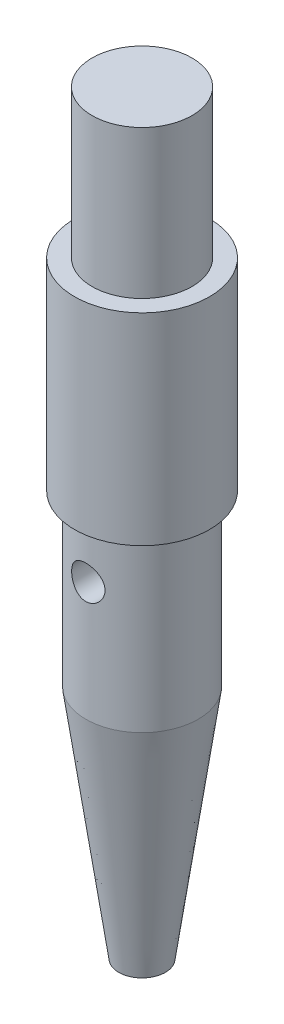
ISO-10303-21;
HEADER;
FILE_DESCRIPTION(('STEP AP214'),'2;1');
FILE_NAME('part.step','',(''),(''),'','','');
FILE_SCHEMA(('AUTOMOTIVE_DESIGN { 1 0 10303 214 1 1 1 1 }'));
ENDSEC;
DATA;
#1=APPLICATION_CONTEXT('core data for automotive mechanical design processes');
#2=APPLICATION_PROTOCOL_DEFINITION('international standard','automotive_design',2000,#1);
#3=PRODUCT_CONTEXT('',#1,'mechanical');
#4=PRODUCT('Part','Part','',(#3));
#5=PRODUCT_RELATED_PRODUCT_CATEGORY('part','',(#4));
#6=PRODUCT_DEFINITION_FORMATION('','',#4);
#7=PRODUCT_DEFINITION_CONTEXT('part definition',#1,'design');
#8=PRODUCT_DEFINITION('design','',#6,#7);
#9=PRODUCT_DEFINITION_SHAPE('','',#8);
#10=(LENGTH_UNIT() NAMED_UNIT(*) SI_UNIT(.MILLI.,.METRE.));
#11=(NAMED_UNIT(*) PLANE_ANGLE_UNIT() SI_UNIT($,.RADIAN.));
#12=(NAMED_UNIT(*) SI_UNIT($,.STERADIAN.) SOLID_ANGLE_UNIT());
#13=UNCERTAINTY_MEASURE_WITH_UNIT(LENGTH_MEASURE(1.E-05),#10,'distance_accuracy_value','');
#14=(GEOMETRIC_REPRESENTATION_CONTEXT(3) GLOBAL_UNCERTAINTY_ASSIGNED_CONTEXT((#13)) GLOBAL_UNIT_ASSIGNED_CONTEXT((#10,
#11,#12)) REPRESENTATION_CONTEXT('',''));
#15=CARTESIAN_POINT('',(0.,0.,0.));
#16=DIRECTION('',(0.,0.,1.));
#17=DIRECTION('',(1.,0.,0.));
#18=AXIS2_PLACEMENT_3D('',#15,#16,#17);
#19=CARTESIAN_POINT('',(0.,0.,0.));
#20=DIRECTION('',(0.,1.,0.));
#21=DIRECTION('',(0.,0.,1.));
#22=AXIS2_PLACEMENT_3D('',#19,#20,#21);
#23=PLANE('',#22);
#24=CARTESIAN_POINT('',(0.,0.,0.));
#25=DIRECTION('',(0.,-1.,0.));
#26=DIRECTION('',(0.,0.,-1.));
#27=AXIS2_PLACEMENT_3D('',#24,#25,#26);
#28=CIRCLE('',#27,4.953);
#29=CARTESIAN_POINT('',(0.,0.,-4.953));
#30=VERTEX_POINT('',#29);
#31=EDGE_CURVE('E10',#30,#30,#28,.T.);
#32=ORIENTED_EDGE('',*,*,#31,.F.);
#33=EDGE_LOOP('',(#32));
#34=FACE_BOUND('',#33,.T.);
#35=ADVANCED_FACE('F33',(#34),#23,.T.);
#36=CARTESIAN_POINT('',(0.,-74.8792,0.));
#37=DIRECTION('',(0.,-1.,0.));
#38=DIRECTION('',(0.,0.,-1.));
#39=AXIS2_PLACEMENT_3D('',#36,#37,#38);
#40=CYLINDRICAL_SURFACE('',#39,4.953);
#41=ORIENTED_EDGE('',*,*,#31,.T.);
#42=EDGE_LOOP('',(#41));
#43=FACE_BOUND('',#42,.T.);
#44=CARTESIAN_POINT('',(0.,-14.6812,0.));
#45=DIRECTION('',(0.,-1.,0.));
#46=DIRECTION('',(0.,0.,-1.));
#47=AXIS2_PLACEMENT_3D('',#44,#45,#46);
#48=CIRCLE('',#47,4.953);
#49=CARTESIAN_POINT('',(0.,-14.6812,-4.953));
#50=VERTEX_POINT('',#49);
#51=EDGE_CURVE('E44',#50,#50,#48,.T.);
#52=ORIENTED_EDGE('',*,*,#51,.F.);
#53=EDGE_LOOP('',(#52));
#54=FACE_BOUND('',#53,.T.);
#55=ADVANCED_FACE('F81',(#43,#54),#40,.T.);
#56=CARTESIAN_POINT('',(4.953,-14.6812,0.));
#57=DIRECTION('',(0.,1.,0.));
#58=DIRECTION('',(0.,0.,1.));
#59=AXIS2_PLACEMENT_3D('',#56,#57,#58);
#60=PLANE('',#59);
#61=ORIENTED_EDGE('',*,*,#51,.T.);
#62=EDGE_LOOP('',(#61));
#63=FACE_BOUND('',#62,.T.);
#64=CARTESIAN_POINT('',(0.,-14.6812,0.));
#65=DIRECTION('',(0.,-1.,0.));
#66=DIRECTION('',(0.,0.,-1.));
#67=AXIS2_PLACEMENT_3D('',#64,#65,#66);
#68=CIRCLE('',#67,6.6929);
#69=CARTESIAN_POINT('',(0.,-14.6812,-6.6929));
#70=VERTEX_POINT('',#69);
#71=EDGE_CURVE('E49',#70,#70,#68,.T.);
#72=ORIENTED_EDGE('',*,*,#71,.F.);
#73=EDGE_LOOP('',(#72));
#74=FACE_BOUND('',#73,.T.);
#75=ADVANCED_FACE('F86',(#63,#74),#60,.T.);
#76=CARTESIAN_POINT('',(0.,-74.8792,0.));
#77=DIRECTION('',(0.,-1.,0.));
#78=DIRECTION('',(0.,0.,-1.));
#79=AXIS2_PLACEMENT_3D('',#76,#77,#78);
#80=CYLINDRICAL_SURFACE('',#79,6.6929);
#81=ORIENTED_EDGE('',*,*,#71,.T.);
#82=EDGE_LOOP('',(#81));
#83=FACE_BOUND('',#82,.T.);
#84=CARTESIAN_POINT('',(0.,-34.671,0.));
#85=DIRECTION('',(0.,-1.,0.));
#86=DIRECTION('',(0.,0.,-1.));
#87=AXIS2_PLACEMENT_3D('',#84,#85,#86);
#88=CIRCLE('',#87,6.6929);
#89=CARTESIAN_POINT('',(0.,-34.671,-6.6929));
#90=VERTEX_POINT('',#89);
#91=EDGE_CURVE('E104',#90,#90,#88,.T.);
#92=ORIENTED_EDGE('',*,*,#91,.F.);
#93=EDGE_LOOP('',(#92));
#94=FACE_BOUND('',#93,.T.);
#95=ADVANCED_FACE('F90',(#83,#94),#80,.T.);
#96=CARTESIAN_POINT('',(6.6929,-34.671,0.));
#97=DIRECTION('',(0.,-1.,0.));
#98=DIRECTION('',(0.,0.,-1.));
#99=AXIS2_PLACEMENT_3D('',#96,#97,#98);
#100=PLANE('',#99);
#101=ORIENTED_EDGE('',*,*,#91,.T.);
#102=EDGE_LOOP('',(#101));
#103=FACE_BOUND('',#102,.T.);
#104=CARTESIAN_POINT('',(0.,-34.671,0.));
#105=DIRECTION('',(0.,-1.,0.));
#106=DIRECTION('',(0.,0.,-1.));
#107=AXIS2_PLACEMENT_3D('',#104,#105,#106);
#108=CIRCLE('',#107,5.5753);
#109=CARTESIAN_POINT('',(0.,-34.671,-5.5753));
#110=VERTEX_POINT('',#109);
#111=EDGE_CURVE('E107',#110,#110,#108,.T.);
#112=ORIENTED_EDGE('',*,*,#111,.F.);
#113=EDGE_LOOP('',(#112));
#114=FACE_BOUND('',#113,.T.);
#115=ADVANCED_FACE('F76',(#103,#114),#100,.T.);
#116=CARTESIAN_POINT('',(0.,-74.8792,0.));
#117=DIRECTION('',(0.,-1.,0.));
#118=DIRECTION('',(0.,0.,-1.));
#119=AXIS2_PLACEMENT_3D('',#116,#117,#118);
#120=CYLINDRICAL_SURFACE('',#119,5.5753);
#121=CARTESIAN_POINT('',(0.,-38.0970595656282,-5.5753));
#122=CARTESIAN_POINT('',(0.0907802411633982,-38.0970607905842,-5.57529914266147));
#123=CARTESIAN_POINT('',(0.181572893017565,-38.1045583947508,-5.57306153356919));
#124=CARTESIAN_POINT('',(0.360517194851362,-38.1342814526153,-5.56435372778573));
#125=CARTESIAN_POINT('',(0.448667997720266,-38.1565115785953,-5.55788218835131));
#126=CARTESIAN_POINT('',(0.619721554631119,-38.2148942894362,-5.54141617336773));
#127=CARTESIAN_POINT('',(0.702631747012946,-38.2510266007506,-5.53142682961907));
#128=CARTESIAN_POINT('',(0.861216768298183,-38.3361057068908,-5.50896529131383));
#129=CARTESIAN_POINT('',(0.936890680979806,-38.3850541215027,-5.49649278296582));
#130=CARTESIAN_POINT('',(1.08098428363115,-38.4958274861462,-5.47000459030922));
#131=CARTESIAN_POINT('',(1.14917158895609,-38.5579472700839,-5.45595781307681));
#132=CARTESIAN_POINT('',(1.27432963206078,-38.6926714485337,-5.42809116674428));
#133=CARTESIAN_POINT('',(1.33129853275416,-38.7652775568804,-5.41427133514705));
#134=CARTESIAN_POINT('',(1.43361592469408,-38.920867873018,-5.38809553930276));
#135=CARTESIAN_POINT('',(1.47868249867588,-39.0040445933536,-5.37577827763025));
#136=CARTESIAN_POINT('',(1.55409424495715,-39.1772203584342,-5.35446615539304));
#137=CARTESIAN_POINT('',(1.58444286393929,-39.2672178001741,-5.34547051708121));
#138=CARTESIAN_POINT('',(1.62872248373754,-39.4488743866799,-5.33214386656876));
#139=CARTESIAN_POINT('',(1.64308118572963,-39.5404201467746,-5.32769161538743));
#140=CARTESIAN_POINT('',(1.65630872894102,-39.7247211722175,-5.32359499933366));
#141=CARTESIAN_POINT('',(1.65518122976173,-39.8174761466358,-5.32394949856003));
#142=CARTESIAN_POINT('',(1.63780469332006,-39.9980997125389,-5.32931876508754));
#143=CARTESIAN_POINT('',(1.62208950183643,-40.0860253591196,-5.33416899912475));
#144=CARTESIAN_POINT('',(1.57684540672711,-40.2579314646033,-5.34771734309298));
#145=CARTESIAN_POINT('',(1.54731516711079,-40.3419115410835,-5.3564158251662));
#146=CARTESIAN_POINT('',(1.47488170830861,-40.5048573455894,-5.37681325319708));
#147=CARTESIAN_POINT('',(1.43180389596621,-40.583740398709,-5.38855099692088));
#148=CARTESIAN_POINT('',(1.3336194993968,-40.7333379158727,-5.41368552163697));
#149=CARTESIAN_POINT('',(1.27851005584602,-40.8040504320649,-5.42708269666602));
#150=CARTESIAN_POINT('',(1.15516717170065,-40.9383299174178,-5.45469570565964));
#151=CARTESIAN_POINT('',(1.08649013304146,-41.0014878224341,-5.4689226433667));
#152=CARTESIAN_POINT('',(0.939342376550519,-41.1154841630565,-5.49610736127987));
#153=CARTESIAN_POINT('',(0.860871069665508,-41.1663218571511,-5.50906506506716));
#154=CARTESIAN_POINT('',(0.695630477391748,-41.2544756854373,-5.53236525250384));
#155=CARTESIAN_POINT('',(0.608811114718597,-41.291702840878,-5.54269039765384));
#156=CARTESIAN_POINT('',(0.429766695528277,-41.3509072872668,-5.55943716876977));
#157=CARTESIAN_POINT('',(0.337543119494253,-41.3728887337889,-5.56585985838185));
#158=CARTESIAN_POINT('',(0.153787111204834,-41.4003008647051,-5.5739105908195));
#159=CARTESIAN_POINT('',(0.0623443200199184,-41.4062861251294,-5.57569922295684));
#160=CARTESIAN_POINT('',(-0.120244174775801,-41.4030879766636,-5.5747504526234));
#161=CARTESIAN_POINT('',(-0.211389915532535,-41.3939065434801,-5.57201363966488));
#162=CARTESIAN_POINT('',(-0.388715830049852,-41.3610848180643,-5.5624264884329));
#163=CARTESIAN_POINT('',(-0.474961129571624,-41.3377670307201,-5.55566796269829));
#164=CARTESIAN_POINT('',(-0.64229780789176,-41.2777210950213,-5.53881773197232));
#165=CARTESIAN_POINT('',(-0.723388570942706,-41.2409913480306,-5.52872562964958));
#166=CARTESIAN_POINT('',(-0.880166943044439,-41.1542230706671,-5.505969360247));
#167=CARTESIAN_POINT('',(-0.955689277755801,-41.1039002854097,-5.4932518130308));
#168=CARTESIAN_POINT('',(-1.09740700477669,-40.9917210243316,-5.46670603450193));
#169=CARTESIAN_POINT('',(-1.16360010315656,-40.9298617204977,-5.45287753132838));
#170=CARTESIAN_POINT('',(-1.28721163416514,-40.7937610575127,-5.4250546027142));
#171=CARTESIAN_POINT('',(-1.34423576131156,-40.7191584584817,-5.4110716771849));
#172=CARTESIAN_POINT('',(-1.44498131853299,-40.5611395827373,-5.38504560835295));
#173=CARTESIAN_POINT('',(-1.48870312801809,-40.4777235574929,-5.37300240972982));
#174=CARTESIAN_POINT('',(-1.56129832361535,-40.3047323095579,-5.35235872398914));
#175=CARTESIAN_POINT('',(-1.59024344957815,-40.2151892853994,-5.34374164928681));
#176=CARTESIAN_POINT('',(-1.63256181057368,-40.0321979301816,-5.33096708719469));
#177=CARTESIAN_POINT('',(-1.64594023215815,-39.9387509106206,-5.32680811448023));
#178=CARTESIAN_POINT('',(-1.65639821065536,-39.7546938796581,-5.32356471626976));
#179=CARTESIAN_POINT('',(-1.65411952408281,-39.6641233699158,-5.32428047351298));
#180=CARTESIAN_POINT('',(-1.63485530584216,-39.4847188608179,-5.33022678726905));
#181=CARTESIAN_POINT('',(-1.61787033894699,-39.3958847949108,-5.33545717040435));
#182=CARTESIAN_POINT('',(-1.57008581616959,-39.223498386111,-5.34971087708398));
#183=CARTESIAN_POINT('',(-1.53945261039898,-39.1398958705626,-5.35868844759406));
#184=CARTESIAN_POINT('',(-1.46537041679873,-38.9789503352442,-5.37941748123782));
#185=CARTESIAN_POINT('',(-1.42191901852471,-38.9016084962756,-5.39116946601338));
#186=CARTESIAN_POINT('',(-1.32161626035209,-38.7523925998984,-5.41664702457347));
#187=CARTESIAN_POINT('',(-1.2643417911703,-38.6808124300628,-5.43042808970933));
#188=CARTESIAN_POINT('',(-1.138784773298,-38.5480710840895,-5.45813761343477));
#189=CARTESIAN_POINT('',(-1.070499390332,-38.4869125989153,-5.47206610910904));
#190=CARTESIAN_POINT('',(-0.922525406850511,-38.3750240281485,-5.49897470155598));
#191=CARTESIAN_POINT('',(-0.842568287914601,-38.3246389630408,-5.51191668894157));
#192=CARTESIAN_POINT('',(-0.674933794362826,-38.2380986668353,-5.53494113638268));
#193=CARTESIAN_POINT('',(-0.587260203079221,-38.2019365093852,-5.54502498763951));
#194=CARTESIAN_POINT('',(-0.416921038533645,-38.1482688752457,-5.560271209017));
#195=CARTESIAN_POINT('',(-0.334809554089188,-38.1291166008229,-5.56586103337043));
#196=CARTESIAN_POINT('',(-0.168468716501111,-38.1035123855199,-5.57337553579345));
#197=CARTESIAN_POINT('',(-0.0842397016413105,-38.0970584289278,-5.57530079556896));
#198=CARTESIAN_POINT('',(0.,-38.0970595656282,-5.5753));
#199=B_SPLINE_CURVE_WITH_KNOTS('',3,(#121,#122,#123,#124,#125,#126,#127,#128,#129,#130,#131,
#132,#133,#134,#135,#136,#137,#138,#139,#140,#141,#142,#143,#144,#145,#146,#147,#148,#149,#150,
#151,#152,#153,#154,#155,#156,#157,#158,#159,#160,#161,#162,#163,#164,#165,#166,#167,#168,#169,
#170,#171,#172,#173,#174,#175,#176,#177,#178,#179,#180,#181,#182,#183,#184,#185,#186,#187,#188,
#189,#190,#191,#192,#193,#194,#195,#196,#197,#198),.UNSPECIFIED.,.T.,.F.,(4,2,2,2,2,2,2,2,2,2,2,
2,2,2,2,2,2,2,2,2,2,2,2,2,2,2,2,2,2,2,2,2,2,2,2,2,2,2,4),(0.,0.272031345676703,
0.544149004872505,0.815871330002298,1.08762801383496,1.36627030726463,1.64495819229808,
1.92975146322386,2.21447800839892,2.49139063740292,2.76823782928676,3.03533689256634,
3.30246179112579,3.57318097801205,3.84396457163049,4.12579225574432,4.40763689789715,
4.69129247373157,4.97487070219985,5.2484816224749,5.52205690332012,5.78961415058622,
6.05720329970634,6.33089137035246,6.60464662012459,6.88810768358827,7.17156066138783,
7.4536240839478,7.73559350100814,8.0060764931205,8.27654909819465,8.54381161555676,
8.81112442335897,9.08798312871783,9.36491321327154,9.6496986677713,9.9343452636047,
10.186817361062,10.4392493782412),.UNSPECIFIED.);
#200=CARTESIAN_POINT('',(0.,-38.0970595656282,-5.5753));
#201=VERTEX_POINT('',#200);
#202=EDGE_CURVE('E36',#201,#201,#199,.T.);
#203=ORIENTED_EDGE('',*,*,#202,.F.);
#204=EDGE_LOOP('',(#203));
#205=FACE_BOUND('',#204,.T.);
#206=CARTESIAN_POINT('',(1.65394043437183,-39.751,5.32432635453068));
#207=CARTESIAN_POINT('',(1.65393917914126,-39.6603189690323,5.32432737917467));
#208=CARTESIAN_POINT('',(1.64645737539418,-39.569625484091,5.32666834911707));
#209=CARTESIAN_POINT('',(1.61680276074434,-39.3908866308507,5.3357428996998));
#210=CARTESIAN_POINT('',(1.59462479040269,-39.3028422039191,5.34247802299938));
#211=CARTESIAN_POINT('',(1.53639442535403,-39.1320146341413,5.35951240208173));
#212=CARTESIAN_POINT('',(1.50036472525983,-39.0492231420601,5.36980582519466));
#213=CARTESIAN_POINT('',(1.41552789592493,-38.8908402188101,5.39278914911507));
#214=CARTESIAN_POINT('',(1.36671894649194,-38.8152498154106,5.4054793912379));
#215=CARTESIAN_POINT('',(1.25609221981284,-38.6710756822129,5.43226686768645));
#216=CARTESIAN_POINT('',(1.19394816525942,-38.6027477264116,5.44639356871852));
#217=CARTESIAN_POINT('',(1.05911475440682,-38.4773143466053,5.4742102533635));
#218=CARTESIAN_POINT('',(0.9864240740517,-38.4202103338113,5.487900181879));
#219=CARTESIAN_POINT('',(0.830746129435811,-38.3177398065788,5.51363493333166));
#220=CARTESIAN_POINT('',(0.747580688068579,-38.272633398101,5.52564098483369));
#221=CARTESIAN_POINT('',(0.574428475664158,-38.1971450376114,5.54631332045601));
#222=CARTESIAN_POINT('',(0.484443146140982,-38.1667599839413,5.55498030800844));
#223=CARTESIAN_POINT('',(0.302880779966216,-38.1224213268895,5.56778949977213));
#224=CARTESIAN_POINT('',(0.211418936768315,-38.1080312934187,5.57205164999219));
#225=CARTESIAN_POINT('',(0.0272864798679038,-38.09471188611,5.5759930255076));
#226=CARTESIAN_POINT('',(-0.0653838814782747,-38.0957793345792,5.57567319275048));
#227=CARTESIAN_POINT('',(-0.24624357124569,-38.1130501262266,5.57057175124873));
#228=CARTESIAN_POINT('',(-0.334482565589962,-38.1287809726815,5.56592943063237));
#229=CARTESIAN_POINT('',(-0.507006683960489,-38.1741610902161,5.55287339181028));
#230=CARTESIAN_POINT('',(-0.591291559406712,-38.2038112350614,5.54445943684664));
#231=CARTESIAN_POINT('',(-0.754646740421004,-38.276512571547,5.52461150368794));
#232=CARTESIAN_POINT('',(-0.833646050739759,-38.3197137423853,5.51314395499649));
#233=CARTESIAN_POINT('',(-0.983426145382607,-38.4181725700512,5.4884072537664));
#234=CARTESIAN_POINT('',(-1.05420500872418,-38.4734330362859,5.47513768168994));
#235=CARTESIAN_POINT('',(-1.18835514905681,-38.5968985929272,5.44762804607657));
#236=CARTESIAN_POINT('',(-1.25134620387792,-38.6655134016187,5.43337025577784));
#237=CARTESIAN_POINT('',(-1.36503362194885,-38.8124726535408,5.40593031988283));
#238=CARTESIAN_POINT('',(-1.41572881906094,-38.8908180185516,5.39274827638886));
#239=CARTESIAN_POINT('',(-1.50377031408258,-39.0559966786964,5.36886895890241));
#240=CARTESIAN_POINT('',(-1.54098960530888,-39.1429013852378,5.35819564256094));
#241=CARTESIAN_POINT('',(-1.60015378134707,-39.3221347434496,5.34082761231837));
#242=CARTESIAN_POINT('',(-1.62210351931059,-39.4144616616416,5.33413163439109));
#243=CARTESIAN_POINT('',(-1.64940069128246,-39.5983063939368,5.32575301487996));
#244=CARTESIAN_POINT('',(-1.65532497344741,-39.6897306956492,5.32389627508161));
#245=CARTESIAN_POINT('',(-1.65201170154269,-39.8722689769403,5.32492546622159));
#246=CARTESIAN_POINT('',(-1.6427762138404,-39.9633829971159,5.32781075079369));
#247=CARTESIAN_POINT('',(-1.60991878367741,-40.1403280359838,5.33782829384685));
#248=CARTESIAN_POINT('',(-1.58666571148472,-40.2262343468849,5.34485155828845));
#249=CARTESIAN_POINT('',(-1.52685951608476,-40.3929211928842,5.36224146574483));
#250=CARTESIAN_POINT('',(-1.490304370606,-40.4737009464143,5.37260861709275));
#251=CARTESIAN_POINT('',(-1.40382956891896,-40.6301948137953,5.39585785019216));
#252=CARTESIAN_POINT('',(-1.35358316418164,-40.7057193814354,5.40879899786436));
#253=CARTESIAN_POINT('',(-1.24154193838871,-40.8474757690747,5.43560997910918));
#254=CARTESIAN_POINT('',(-1.1797444152248,-40.9137054083876,5.44948002948824));
#255=CARTESIAN_POINT('',(-1.04364769288122,-41.0375014457323,5.47720352512237));
#256=CARTESIAN_POINT('',(-0.968972230247275,-41.0946595320869,5.49103759021682));
#257=CARTESIAN_POINT('',(-0.810761496313387,-41.1956416899098,5.51661557586261));
#258=CARTESIAN_POINT('',(-0.727226672140727,-41.2394664338734,5.52835960181708));
#259=CARTESIAN_POINT('',(-0.554228182383954,-41.3121154813929,5.54836168135512));
#260=CARTESIAN_POINT('',(-0.464814974899403,-41.341052398502,5.55664581337579));
#261=CARTESIAN_POINT('',(-0.282105760887226,-41.3833977965194,5.56890989329988));
#262=CARTESIAN_POINT('',(-0.188810845919881,-41.3968106127341,5.57289104284636));
#263=CARTESIAN_POINT('',(-0.00476398584839497,-41.4074033352318,5.57602914014529));
#264=CARTESIAN_POINT('',(0.0859512676096006,-41.4051760315405,5.57536226413883));
#265=CARTESIAN_POINT('',(0.265659384424444,-41.3859645539737,5.56969270699693));
#266=CARTESIAN_POINT('',(0.354652341470175,-41.3689811851132,5.56469026238783));
#267=CARTESIAN_POINT('',(0.527499805585039,-41.3211035421235,5.55096035213885));
#268=CARTESIAN_POINT('',(0.611397785782953,-41.2903543018529,5.54227177144117));
#269=CARTESIAN_POINT('',(0.772888271105474,-41.2159472734931,5.52206880884273));
#270=CARTESIAN_POINT('',(0.850479750720966,-41.1722873913185,5.51055396857873));
#271=CARTESIAN_POINT('',(0.999808255239099,-41.0717042071741,5.48545987666298));
#272=CARTESIAN_POINT('',(1.07128416123679,-41.0144067095163,5.47182705738531));
#273=CARTESIAN_POINT('',(1.20380503545887,-40.8888523332727,5.44420928885713));
#274=CARTESIAN_POINT('',(1.26484701886193,-40.8205923294497,5.43022424015309));
#275=CARTESIAN_POINT('',(1.37653982144767,-40.6726781947508,5.40300976571577));
#276=CARTESIAN_POINT('',(1.42683864541681,-40.5927514065934,5.38981393747242));
#277=CARTESIAN_POINT('',(1.5132250315855,-40.4251976115719,5.36620325979076));
#278=CARTESIAN_POINT('',(1.54931969590265,-40.3375744797773,5.35578702139094));
#279=CARTESIAN_POINT('',(1.60286238745984,-40.1673905417915,5.33998970785653));
#280=CARTESIAN_POINT('',(1.62196474607064,-40.0853880956361,5.33417058071028));
#281=CARTESIAN_POINT('',(1.64750315096634,-39.9192604029224,5.32633878958889));
#282=CARTESIAN_POINT('',(1.65394159899831,-39.8351355619482,5.32432540384675));
#283=CARTESIAN_POINT('',(1.65394043437183,-39.751,5.32432635453068));
#284=B_SPLINE_CURVE_WITH_KNOTS('',3,(#206,#207,#208,#209,#210,#211,#212,#213,#214,#215,#216,
#217,#218,#219,#220,#221,#222,#223,#224,#225,#226,#227,#228,#229,#230,#231,#232,#233,#234,#235,
#236,#237,#238,#239,#240,#241,#242,#243,#244,#245,#246,#247,#248,#249,#250,#251,#252,#253,#254,
#255,#256,#257,#258,#259,#260,#261,#262,#263,#264,#265,#266,#267,#268,#269,#270,#271,#272,#273,
#274,#275,#276,#277,#278,#279,#280,#281,#282,#283),.UNSPECIFIED.,.T.,.F.,(4,2,2,2,2,2,2,2,2,2,2,
2,2,2,2,2,2,2,2,2,2,2,2,2,2,2,2,2,2,2,2,2,2,2,2,2,2,2,4),(0.,0.271732836910582,0.54356112267639,
0.814945931190811,1.08636941502197,1.36540058529223,1.64446681635625,1.92916437819885,
2.21380193068985,2.49046632024446,2.76707383494804,3.03506542888368,3.30307384789081,
3.57415990501412,3.84530918354667,4.12668842412222,4.40809434024717,4.69208733797616,
4.97599003237204,5.24952826078383,5.52302920739345,5.78962933587541,6.05627001166356,
6.32993608020658,6.60366624669005,6.88746591349909,7.1712512638994,7.45285724066669,
7.73438455632641,8.00530064434734,8.27620195350891,8.54431393339603,8.81246942449294,
9.08906465907937,9.36573888703055,9.65042306376421,9.93496471624353,10.1871313695013,
10.4392501940146),.UNSPECIFIED.);
#285=CARTESIAN_POINT('',(1.65394043437183,-39.751,5.32432635453068));
#286=VERTEX_POINT('',#285);
#287=EDGE_CURVE('E52',#286,#286,#284,.T.);
#288=ORIENTED_EDGE('',*,*,#287,.F.);
#289=EDGE_LOOP('',(#288));
#290=FACE_BOUND('',#289,.T.);
#291=ORIENTED_EDGE('',*,*,#111,.T.);
#292=EDGE_LOOP('',(#291));
#293=FACE_BOUND('',#292,.T.);
#294=CARTESIAN_POINT('',(0.,-51.5112,0.));
#295=DIRECTION('',(0.,-1.,0.));
#296=DIRECTION('',(0.,0.,-1.));
#297=AXIS2_PLACEMENT_3D('',#294,#295,#296);
#298=CIRCLE('',#297,5.5753);
#299=CARTESIAN_POINT('',(0.,-51.5112,-5.5753));
#300=VERTEX_POINT('',#299);
#301=EDGE_CURVE('E109',#300,#300,#298,.T.);
#302=ORIENTED_EDGE('',*,*,#301,.F.);
#303=EDGE_LOOP('',(#302));
#304=FACE_BOUND('',#303,.T.);
#305=ADVANCED_FACE('F56',(#205,#290,#293,#304),#120,.T.);
#306=CARTESIAN_POINT('',(0.,-74.8792,0.));
#307=DIRECTION('',(0.,1.,0.));
#308=DIRECTION('',(0.,0.,1.));
#309=AXIS2_PLACEMENT_3D('',#306,#307,#308);
#310=CONICAL_SURFACE('',#309,2.3114,0.138776108658938);
#311=ORIENTED_EDGE('',*,*,#301,.T.);
#312=EDGE_LOOP('',(#311));
#313=FACE_BOUND('',#312,.T.);
#314=CARTESIAN_POINT('',(0.,-74.8792,0.));
#315=DIRECTION('',(0.,-1.,0.));
#316=DIRECTION('',(0.,0.,-1.));
#317=AXIS2_PLACEMENT_3D('',#314,#315,#316);
#318=CIRCLE('',#317,2.3114);
#319=CARTESIAN_POINT('',(0.,-74.8792,-2.3114));
#320=VERTEX_POINT('',#319);
#321=EDGE_CURVE('E112',#320,#320,#318,.T.);
#322=ORIENTED_EDGE('',*,*,#321,.F.);
#323=EDGE_LOOP('',(#322));
#324=FACE_BOUND('',#323,.T.);
#325=ADVANCED_FACE('F68',(#313,#324),#310,.T.);
#326=CARTESIAN_POINT('',(2.3114,-74.8792,0.));
#327=DIRECTION('',(0.,-1.,0.));
#328=DIRECTION('',(0.,0.,-1.));
#329=AXIS2_PLACEMENT_3D('',#326,#327,#328);
#330=PLANE('',#329);
#331=ORIENTED_EDGE('',*,*,#321,.T.);
#332=EDGE_LOOP('',(#331));
#333=FACE_BOUND('',#332,.T.);
#334=ADVANCED_FACE('F64',(#333),#330,.T.);
#335=CARTESIAN_POINT('',(0.,-39.751,-6.6929));
#336=DIRECTION('',(0.,0.,1.));
#337=DIRECTION('',(1.,0.,0.));
#338=AXIS2_PLACEMENT_3D('',#335,#336,#337);
#339=CYLINDRICAL_SURFACE('',#338,1.65394043437183);
#340=ORIENTED_EDGE('',*,*,#202,.T.);
#341=EDGE_LOOP('',(#340));
#342=FACE_BOUND('',#341,.T.);
#343=ORIENTED_EDGE('',*,*,#287,.T.);
#344=EDGE_LOOP('',(#343));
#345=FACE_BOUND('',#344,.T.);
#346=ADVANCED_FACE('F60',(#342,#345),#339,.F.);
#347=CLOSED_SHELL('',(#35,#55,#75,#95,#115,#305,#325,#334,#346));
#348=MANIFOLD_SOLID_BREP('B2',#347);
#349=ADVANCED_BREP_SHAPE_REPRESENTATION('',(#18,#348),#14);
#350=SHAPE_DEFINITION_REPRESENTATION(#9,#349);
ENDSEC;
END-ISO-10303-21;
